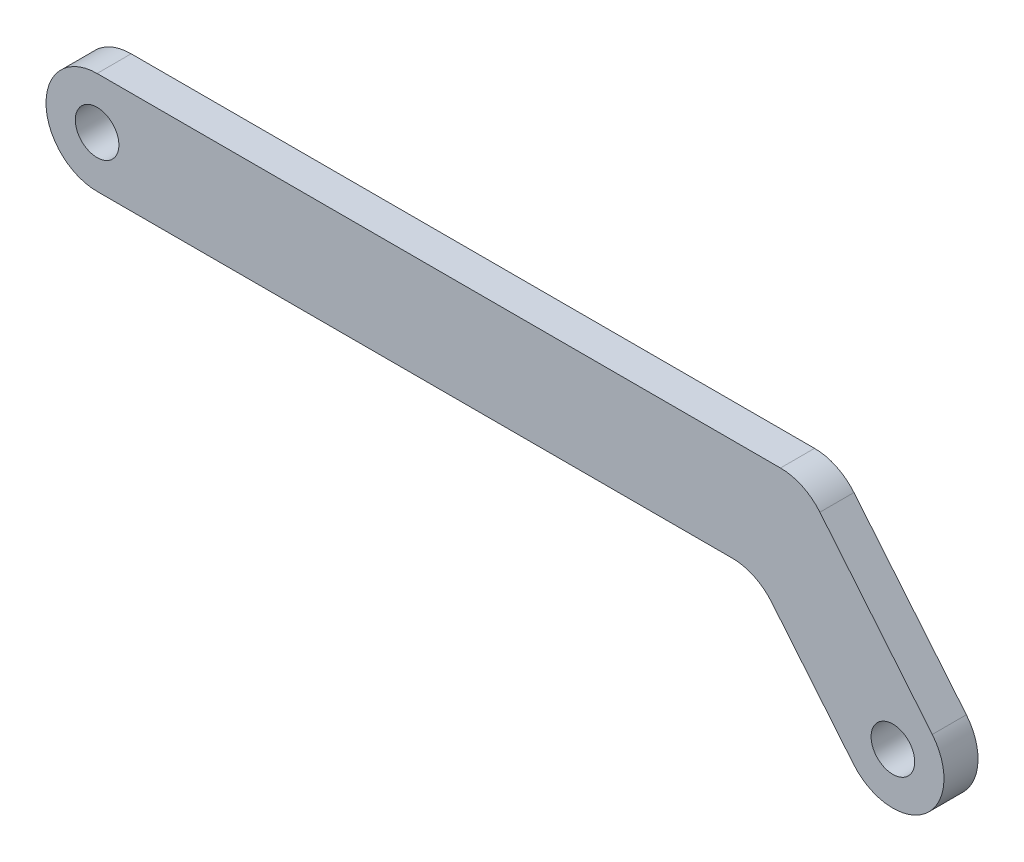
ISO-10303-21;
HEADER;
FILE_DESCRIPTION(('STEP AP214'),'2;1');
FILE_NAME('part.step','',(''),(''),'','','');
FILE_SCHEMA(('AUTOMOTIVE_DESIGN { 1 0 10303 214 1 1 1 1 }'));
ENDSEC;
DATA;
#1=APPLICATION_CONTEXT('core data for automotive mechanical design processes');
#2=APPLICATION_PROTOCOL_DEFINITION('international standard','automotive_design',2000,#1);
#3=PRODUCT_CONTEXT('',#1,'mechanical');
#4=PRODUCT('Part','Part','',(#3));
#5=PRODUCT_RELATED_PRODUCT_CATEGORY('part','',(#4));
#6=PRODUCT_DEFINITION_FORMATION('','',#4);
#7=PRODUCT_DEFINITION_CONTEXT('part definition',#1,'design');
#8=PRODUCT_DEFINITION('design','',#6,#7);
#9=PRODUCT_DEFINITION_SHAPE('','',#8);
#10=(LENGTH_UNIT() NAMED_UNIT(*) SI_UNIT(.MILLI.,.METRE.));
#11=(NAMED_UNIT(*) PLANE_ANGLE_UNIT() SI_UNIT($,.RADIAN.));
#12=(NAMED_UNIT(*) SI_UNIT($,.STERADIAN.) SOLID_ANGLE_UNIT());
#13=UNCERTAINTY_MEASURE_WITH_UNIT(LENGTH_MEASURE(1.E-05),#10,'distance_accuracy_value','');
#14=(GEOMETRIC_REPRESENTATION_CONTEXT(3) GLOBAL_UNCERTAINTY_ASSIGNED_CONTEXT((#13)) GLOBAL_UNIT_ASSIGNED_CONTEXT((#10,
#11,#12)) REPRESENTATION_CONTEXT('',''));
#15=CARTESIAN_POINT('',(0.,0.,0.));
#16=DIRECTION('',(0.,0.,1.));
#17=DIRECTION('',(1.,0.,0.));
#18=AXIS2_PLACEMENT_3D('',#15,#16,#17);
#19=CARTESIAN_POINT('',(0.,0.,3.175));
#20=DIRECTION('',(0.,0.,1.));
#21=DIRECTION('',(1.,0.,0.));
#22=AXIS2_PLACEMENT_3D('',#19,#20,#21);
#23=PLANE('',#22);
#24=CARTESIAN_POINT('',(0.,0.,3.175));
#25=DIRECTION('',(0.,0.,1.));
#26=DIRECTION('',(1.,0.,0.));
#27=AXIS2_PLACEMENT_3D('',#24,#25,#26);
#28=CIRCLE('',#27,2.032);
#29=CARTESIAN_POINT('',(2.032,0.,3.175));
#30=VERTEX_POINT('',#29);
#31=EDGE_CURVE('E152',#30,#30,#28,.T.);
#32=ORIENTED_EDGE('',*,*,#31,.F.);
#33=EDGE_LOOP('',(#32));
#34=FACE_BOUND('',#33,.T.);
#35=CARTESIAN_POINT('',(0.,0.,3.175));
#36=DIRECTION('',(0.,0.,1.));
#37=DIRECTION('',(1.,0.,0.));
#38=AXIS2_PLACEMENT_3D('',#35,#36,#37);
#39=CIRCLE('',#38,4.7625);
#40=CARTESIAN_POINT('',(-3.67366523904712,-3.03077382221387,3.175));
#41=VERTEX_POINT('',#40);
#42=CARTESIAN_POINT('',(3.67366523904712,3.03077382221387,3.175));
#43=VERTEX_POINT('',#42);
#44=EDGE_CURVE('E170',#41,#43,#39,.T.);
#45=ORIENTED_EDGE('',*,*,#44,.T.);
#46=DIRECTION('',(-0.636382954795563,0.771373278540078,0.));
#47=VECTOR('',#46,1.);
#48=CARTESIAN_POINT('',(-6.80383476095287,15.7307738222139,3.175));
#49=LINE('',#48,#47);
#50=CARTESIAN_POINT('',(-6.80383476095287,15.7307738222139,3.175));
#51=VERTEX_POINT('',#50);
#52=EDGE_CURVE('E106',#43,#51,#49,.T.);
#53=ORIENTED_EDGE('',*,*,#52,.T.);
#54=CARTESIAN_POINT('',(-10.4775,12.7,3.175));
#55=DIRECTION('',(0.,0.,1.));
#56=DIRECTION('',(1.,0.,0.));
#57=AXIS2_PLACEMENT_3D('',#54,#55,#56);
#58=CIRCLE('',#57,4.76250000000001);
#59=CARTESIAN_POINT('',(-10.4775,17.4625,3.175));
#60=VERTEX_POINT('',#59);
#61=EDGE_CURVE('E191',#51,#60,#58,.T.);
#62=ORIENTED_EDGE('',*,*,#61,.T.);
#63=DIRECTION('',(-1.,0.,0.));
#64=VECTOR('',#63,1.);
#65=CARTESIAN_POINT('',(-74.1772001431822,17.4625,3.175));
#66=LINE('',#65,#64);
#67=CARTESIAN_POINT('',(-74.1772001431822,17.4625,3.175));
#68=VERTEX_POINT('',#67);
#69=EDGE_CURVE('E205',#60,#68,#66,.T.);
#70=ORIENTED_EDGE('',*,*,#69,.T.);
#71=CARTESIAN_POINT('',(-74.1772001431822,12.7,3.175));
#72=DIRECTION('',(0.,0.,1.));
#73=DIRECTION('',(1.,0.,0.));
#74=AXIS2_PLACEMENT_3D('',#71,#72,#73);
#75=CIRCLE('',#74,4.7625);
#76=CARTESIAN_POINT('',(-74.1772001431822,7.9375,3.175));
#77=VERTEX_POINT('',#76);
#78=EDGE_CURVE('E125',#68,#77,#75,.T.);
#79=ORIENTED_EDGE('',*,*,#78,.T.);
#80=DIRECTION('',(1.,0.,0.));
#81=VECTOR('',#80,1.);
#82=CARTESIAN_POINT('',(-14.9674822847471,7.93750000000001,3.175));
#83=LINE('',#82,#81);
#84=CARTESIAN_POINT('',(-14.9674822847471,7.93750000000001,3.175));
#85=VERTEX_POINT('',#84);
#86=EDGE_CURVE('E119',#77,#85,#83,.T.);
#87=ORIENTED_EDGE('',*,*,#86,.T.);
#88=CARTESIAN_POINT('',(-14.9674822847471,3.17499999999999,3.175));
#89=DIRECTION('',(0.,0.,-1.));
#90=DIRECTION('',(1.,0.,0.));
#91=AXIS2_PLACEMENT_3D('',#88,#89,#90);
#92=CIRCLE('',#91,4.76250000000001);
#93=CARTESIAN_POINT('',(-11.2938170457,6.20577382221387,3.175));
#94=VERTEX_POINT('',#93);
#95=EDGE_CURVE('E123',#85,#94,#92,.T.);
#96=ORIENTED_EDGE('',*,*,#95,.T.);
#97=DIRECTION('',(0.636382954795563,-0.771373278540078,0.));
#98=VECTOR('',#97,1.);
#99=CARTESIAN_POINT('',(-11.2938170457,6.20577382221387,3.175));
#100=LINE('',#99,#98);
#101=EDGE_CURVE('E63',#94,#41,#100,.T.);
#102=ORIENTED_EDGE('',*,*,#101,.T.);
#103=EDGE_LOOP('',(#45,#53,#62,#70,#79,#87,#96,#102));
#104=FACE_BOUND('',#103,.T.);
#105=CARTESIAN_POINT('',(-74.1772001431822,12.7,3.175));
#106=DIRECTION('',(0.,0.,1.));
#107=DIRECTION('',(1.,0.,0.));
#108=AXIS2_PLACEMENT_3D('',#105,#106,#107);
#109=CIRCLE('',#108,2.03200000000001);
#110=CARTESIAN_POINT('',(-72.1452001431822,12.7,3.175));
#111=VERTEX_POINT('',#110);
#112=EDGE_CURVE('E219',#111,#111,#109,.T.);
#113=ORIENTED_EDGE('',*,*,#112,.F.);
#114=EDGE_LOOP('',(#113));
#115=FACE_BOUND('',#114,.T.);
#116=ADVANCED_FACE('F45',(#34,#104,#115),#23,.T.);
#117=CARTESIAN_POINT('',(0.,0.,0.));
#118=DIRECTION('',(0.,0.,1.));
#119=DIRECTION('',(1.,0.,0.));
#120=AXIS2_PLACEMENT_3D('',#117,#118,#119);
#121=PLANE('',#120);
#122=CARTESIAN_POINT('',(0.,0.,0.));
#123=DIRECTION('',(0.,0.,1.));
#124=DIRECTION('',(1.,0.,0.));
#125=AXIS2_PLACEMENT_3D('',#122,#123,#124);
#126=CIRCLE('',#125,4.7625);
#127=CARTESIAN_POINT('',(-3.67366523904712,-3.03077382221387,0.));
#128=VERTEX_POINT('',#127);
#129=CARTESIAN_POINT('',(3.67366523904712,3.03077382221387,0.));
#130=VERTEX_POINT('',#129);
#131=EDGE_CURVE('E147',#128,#130,#126,.T.);
#132=ORIENTED_EDGE('',*,*,#131,.F.);
#133=DIRECTION('',(0.636382954795563,-0.771373278540078,0.));
#134=VECTOR('',#133,1.);
#135=CARTESIAN_POINT('',(-11.2938170457,6.20577382221387,0.));
#136=LINE('',#135,#134);
#137=CARTESIAN_POINT('',(-11.2938170457,6.20577382221387,0.));
#138=VERTEX_POINT('',#137);
#139=EDGE_CURVE('E98',#138,#128,#136,.T.);
#140=ORIENTED_EDGE('',*,*,#139,.F.);
#141=CARTESIAN_POINT('',(-14.9674822847471,3.17499999999999,0.));
#142=DIRECTION('',(0.,0.,-1.));
#143=DIRECTION('',(1.,0.,0.));
#144=AXIS2_PLACEMENT_3D('',#141,#142,#143);
#145=CIRCLE('',#144,4.76250000000001);
#146=CARTESIAN_POINT('',(-14.9674822847471,7.93750000000001,0.));
#147=VERTEX_POINT('',#146);
#148=EDGE_CURVE('E92',#147,#138,#145,.T.);
#149=ORIENTED_EDGE('',*,*,#148,.F.);
#150=DIRECTION('',(1.,0.,0.));
#151=VECTOR('',#150,1.);
#152=CARTESIAN_POINT('',(-14.9674822847471,7.93750000000001,0.));
#153=LINE('',#152,#151);
#154=CARTESIAN_POINT('',(-74.1772001431822,7.9375,0.));
#155=VERTEX_POINT('',#154);
#156=EDGE_CURVE('E134',#155,#147,#153,.T.);
#157=ORIENTED_EDGE('',*,*,#156,.F.);
#158=CARTESIAN_POINT('',(-74.1772001431822,12.7,0.));
#159=DIRECTION('',(0.,0.,1.));
#160=DIRECTION('',(1.,0.,0.));
#161=AXIS2_PLACEMENT_3D('',#158,#159,#160);
#162=CIRCLE('',#161,4.7625);
#163=CARTESIAN_POINT('',(-74.1772001431822,17.4625,0.));
#164=VERTEX_POINT('',#163);
#165=EDGE_CURVE('E161',#164,#155,#162,.T.);
#166=ORIENTED_EDGE('',*,*,#165,.F.);
#167=DIRECTION('',(-1.,0.,0.));
#168=VECTOR('',#167,1.);
#169=CARTESIAN_POINT('',(-74.1772001431822,17.4625,0.));
#170=LINE('',#169,#168);
#171=CARTESIAN_POINT('',(-10.4775,17.4625,0.));
#172=VERTEX_POINT('',#171);
#173=EDGE_CURVE('E158',#172,#164,#170,.T.);
#174=ORIENTED_EDGE('',*,*,#173,.F.);
#175=CARTESIAN_POINT('',(-10.4775,12.7,0.));
#176=DIRECTION('',(0.,0.,1.));
#177=DIRECTION('',(1.,0.,0.));
#178=AXIS2_PLACEMENT_3D('',#175,#176,#177);
#179=CIRCLE('',#178,4.76250000000001);
#180=CARTESIAN_POINT('',(-6.80383476095287,15.7307738222139,0.));
#181=VERTEX_POINT('',#180);
#182=EDGE_CURVE('E155',#181,#172,#179,.T.);
#183=ORIENTED_EDGE('',*,*,#182,.F.);
#184=DIRECTION('',(-0.636382954795563,0.771373278540078,0.));
#185=VECTOR('',#184,1.);
#186=CARTESIAN_POINT('',(-6.80383476095287,15.7307738222139,0.));
#187=LINE('',#186,#185);
#188=EDGE_CURVE('E151',#130,#181,#187,.T.);
#189=ORIENTED_EDGE('',*,*,#188,.F.);
#190=EDGE_LOOP('',(#132,#140,#149,#157,#166,#174,#183,#189));
#191=FACE_BOUND('',#190,.T.);
#192=CARTESIAN_POINT('',(0.,0.,0.));
#193=DIRECTION('',(0.,0.,1.));
#194=DIRECTION('',(1.,0.,0.));
#195=AXIS2_PLACEMENT_3D('',#192,#193,#194);
#196=CIRCLE('',#195,2.032);
#197=CARTESIAN_POINT('',(2.032,0.,0.));
#198=VERTEX_POINT('',#197);
#199=EDGE_CURVE('E215',#198,#198,#196,.T.);
#200=ORIENTED_EDGE('',*,*,#199,.T.);
#201=EDGE_LOOP('',(#200));
#202=FACE_BOUND('',#201,.T.);
#203=CARTESIAN_POINT('',(-74.1772001431822,12.7,0.));
#204=DIRECTION('',(0.,0.,1.));
#205=DIRECTION('',(1.,0.,0.));
#206=AXIS2_PLACEMENT_3D('',#203,#204,#205);
#207=CIRCLE('',#206,2.03200000000001);
#208=CARTESIAN_POINT('',(-72.1452001431822,12.7,0.));
#209=VERTEX_POINT('',#208);
#210=EDGE_CURVE('E223',#209,#209,#207,.T.);
#211=ORIENTED_EDGE('',*,*,#210,.T.);
#212=EDGE_LOOP('',(#211));
#213=FACE_BOUND('',#212,.T.);
#214=ADVANCED_FACE('F195',(#191,#202,#213),#121,.F.);
#215=CARTESIAN_POINT('',(0.,0.,3.175));
#216=DIRECTION('',(0.,0.,-1.));
#217=DIRECTION('',(-1.,0.,0.));
#218=AXIS2_PLACEMENT_3D('',#215,#216,#217);
#219=CYLINDRICAL_SURFACE('',#218,4.7625);
#220=ORIENTED_EDGE('',*,*,#131,.T.);
#221=DIRECTION('',(0.,0.,-1.));
#222=VECTOR('',#221,1.);
#223=CARTESIAN_POINT('',(3.67366523904712,3.03077382221387,3.175));
#224=LINE('',#223,#222);
#225=EDGE_CURVE('E11',#43,#130,#224,.T.);
#226=ORIENTED_EDGE('',*,*,#225,.F.);
#227=ORIENTED_EDGE('',*,*,#44,.F.);
#228=DIRECTION('',(0.,0.,-1.));
#229=VECTOR('',#228,1.);
#230=CARTESIAN_POINT('',(-3.67366523904712,-3.03077382221387,3.175));
#231=LINE('',#230,#229);
#232=EDGE_CURVE('E143',#41,#128,#231,.T.);
#233=ORIENTED_EDGE('',*,*,#232,.T.);
#234=EDGE_LOOP('',(#220,#226,#227,#233));
#235=FACE_BOUND('',#234,.T.);
#236=ADVANCED_FACE('F47',(#235),#219,.T.);
#237=CARTESIAN_POINT('',(-6.80383476095287,15.7307738222139,3.175));
#238=DIRECTION('',(-0.771373278540078,-0.636382954795563,0.));
#239=DIRECTION('',(0.636382954795563,-0.771373278540078,0.));
#240=AXIS2_PLACEMENT_3D('',#237,#238,#239);
#241=PLANE('',#240);
#242=ORIENTED_EDGE('',*,*,#188,.T.);
#243=DIRECTION('',(0.,0.,-1.));
#244=VECTOR('',#243,1.);
#245=CARTESIAN_POINT('',(-6.80383476095287,15.7307738222139,3.175));
#246=LINE('',#245,#244);
#247=EDGE_CURVE('E55',#51,#181,#246,.T.);
#248=ORIENTED_EDGE('',*,*,#247,.F.);
#249=ORIENTED_EDGE('',*,*,#52,.F.);
#250=ORIENTED_EDGE('',*,*,#225,.T.);
#251=EDGE_LOOP('',(#242,#248,#249,#250));
#252=FACE_BOUND('',#251,.T.);
#253=ADVANCED_FACE('F257',(#252),#241,.F.);
#254=CARTESIAN_POINT('',(-10.4775,12.7,3.175));
#255=DIRECTION('',(0.,0.,-1.));
#256=DIRECTION('',(-1.,0.,0.));
#257=AXIS2_PLACEMENT_3D('',#254,#255,#256);
#258=CYLINDRICAL_SURFACE('',#257,4.76250000000001);
#259=ORIENTED_EDGE('',*,*,#182,.T.);
#260=DIRECTION('',(0.,0.,-1.));
#261=VECTOR('',#260,1.);
#262=CARTESIAN_POINT('',(-10.4775,17.4625,3.175));
#263=LINE('',#262,#261);
#264=EDGE_CURVE('E181',#60,#172,#263,.T.);
#265=ORIENTED_EDGE('',*,*,#264,.F.);
#266=ORIENTED_EDGE('',*,*,#61,.F.);
#267=ORIENTED_EDGE('',*,*,#247,.T.);
#268=EDGE_LOOP('',(#259,#265,#266,#267));
#269=FACE_BOUND('',#268,.T.);
#270=ADVANCED_FACE('F189',(#269),#258,.T.);
#271=CARTESIAN_POINT('',(-74.1772001431822,17.4625,3.175));
#272=DIRECTION('',(0.,-1.,0.));
#273=DIRECTION('',(1.,0.,0.));
#274=AXIS2_PLACEMENT_3D('',#271,#272,#273);
#275=PLANE('',#274);
#276=ORIENTED_EDGE('',*,*,#173,.T.);
#277=DIRECTION('',(0.,0.,-1.));
#278=VECTOR('',#277,1.);
#279=CARTESIAN_POINT('',(-74.1772001431822,17.4625,3.175));
#280=LINE('',#279,#278);
#281=EDGE_CURVE('E177',#68,#164,#280,.T.);
#282=ORIENTED_EDGE('',*,*,#281,.F.);
#283=ORIENTED_EDGE('',*,*,#69,.F.);
#284=ORIENTED_EDGE('',*,*,#264,.T.);
#285=EDGE_LOOP('',(#276,#282,#283,#284));
#286=FACE_BOUND('',#285,.T.);
#287=ADVANCED_FACE('F200',(#286),#275,.F.);
#288=CARTESIAN_POINT('',(-74.1772001431822,12.7,3.175));
#289=DIRECTION('',(0.,0.,-1.));
#290=DIRECTION('',(-1.,0.,0.));
#291=AXIS2_PLACEMENT_3D('',#288,#289,#290);
#292=CYLINDRICAL_SURFACE('',#291,4.7625);
#293=ORIENTED_EDGE('',*,*,#165,.T.);
#294=DIRECTION('',(0.,0.,-1.));
#295=VECTOR('',#294,1.);
#296=CARTESIAN_POINT('',(-74.1772001431822,7.9375,3.175));
#297=LINE('',#296,#295);
#298=EDGE_CURVE('E136',#77,#155,#297,.T.);
#299=ORIENTED_EDGE('',*,*,#298,.F.);
#300=ORIENTED_EDGE('',*,*,#78,.F.);
#301=ORIENTED_EDGE('',*,*,#281,.T.);
#302=EDGE_LOOP('',(#293,#299,#300,#301));
#303=FACE_BOUND('',#302,.T.);
#304=ADVANCED_FACE('F203',(#303),#292,.T.);
#305=CARTESIAN_POINT('',(-14.9674822847471,7.93750000000001,3.175));
#306=DIRECTION('',(0.,1.,0.));
#307=DIRECTION('',(-1.,0.,0.));
#308=AXIS2_PLACEMENT_3D('',#305,#306,#307);
#309=PLANE('',#308);
#310=ORIENTED_EDGE('',*,*,#156,.T.);
#311=DIRECTION('',(0.,0.,-1.));
#312=VECTOR('',#311,1.);
#313=CARTESIAN_POINT('',(-14.9674822847471,7.93750000000001,3.175));
#314=LINE('',#313,#312);
#315=EDGE_CURVE('E131',#85,#147,#314,.T.);
#316=ORIENTED_EDGE('',*,*,#315,.F.);
#317=ORIENTED_EDGE('',*,*,#86,.F.);
#318=ORIENTED_EDGE('',*,*,#298,.T.);
#319=EDGE_LOOP('',(#310,#316,#317,#318));
#320=FACE_BOUND('',#319,.T.);
#321=ADVANCED_FACE('F132',(#320),#309,.F.);
#322=CARTESIAN_POINT('',(-14.9674822847471,3.17499999999999,3.175));
#323=DIRECTION('',(0.,0.,-1.));
#324=DIRECTION('',(-1.,0.,0.));
#325=AXIS2_PLACEMENT_3D('',#322,#323,#324);
#326=CYLINDRICAL_SURFACE('',#325,4.76250000000001);
#327=ORIENTED_EDGE('',*,*,#148,.T.);
#328=DIRECTION('',(0.,0.,-1.));
#329=VECTOR('',#328,1.);
#330=CARTESIAN_POINT('',(-11.2938170457,6.20577382221387,3.175));
#331=LINE('',#330,#329);
#332=EDGE_CURVE('E137',#94,#138,#331,.T.);
#333=ORIENTED_EDGE('',*,*,#332,.F.);
#334=ORIENTED_EDGE('',*,*,#95,.F.);
#335=ORIENTED_EDGE('',*,*,#315,.T.);
#336=EDGE_LOOP('',(#327,#333,#334,#335));
#337=FACE_BOUND('',#336,.T.);
#338=ADVANCED_FACE('F139',(#337),#326,.F.);
#339=CARTESIAN_POINT('',(-11.2938170457,6.20577382221387,3.175));
#340=DIRECTION('',(0.771373278540078,0.636382954795563,0.));
#341=DIRECTION('',(-0.636382954795563,0.771373278540078,0.));
#342=AXIS2_PLACEMENT_3D('',#339,#340,#341);
#343=PLANE('',#342);
#344=ORIENTED_EDGE('',*,*,#139,.T.);
#345=ORIENTED_EDGE('',*,*,#232,.F.);
#346=ORIENTED_EDGE('',*,*,#101,.F.);
#347=ORIENTED_EDGE('',*,*,#332,.T.);
#348=EDGE_LOOP('',(#344,#345,#346,#347));
#349=FACE_BOUND('',#348,.T.);
#350=ADVANCED_FACE('F245',(#349),#343,.F.);
#351=CARTESIAN_POINT('',(0.,0.,3.175));
#352=DIRECTION('',(0.,0.,-1.));
#353=DIRECTION('',(-1.,0.,0.));
#354=AXIS2_PLACEMENT_3D('',#351,#352,#353);
#355=CYLINDRICAL_SURFACE('',#354,2.032);
#356=ORIENTED_EDGE('',*,*,#31,.T.);
#357=EDGE_LOOP('',(#356));
#358=FACE_BOUND('',#357,.T.);
#359=ORIENTED_EDGE('',*,*,#199,.F.);
#360=EDGE_LOOP('',(#359));
#361=FACE_BOUND('',#360,.T.);
#362=ADVANCED_FACE('F242',(#358,#361),#355,.F.);
#363=CARTESIAN_POINT('',(-74.1772001431822,12.7,3.175));
#364=DIRECTION('',(0.,0.,-1.));
#365=DIRECTION('',(-1.,0.,0.));
#366=AXIS2_PLACEMENT_3D('',#363,#364,#365);
#367=CYLINDRICAL_SURFACE('',#366,2.03200000000001);
#368=ORIENTED_EDGE('',*,*,#112,.T.);
#369=EDGE_LOOP('',(#368));
#370=FACE_BOUND('',#369,.T.);
#371=ORIENTED_EDGE('',*,*,#210,.F.);
#372=EDGE_LOOP('',(#371));
#373=FACE_BOUND('',#372,.T.);
#374=ADVANCED_FACE('F231',(#370,#373),#367,.F.);
#375=CLOSED_SHELL('',(#116,#214,#236,#253,#270,#287,#304,#321,#338,#350,#362,#374));
#376=MANIFOLD_SOLID_BREP('B2',#375);
#377=ADVANCED_BREP_SHAPE_REPRESENTATION('',(#18,#376),#14);
#378=SHAPE_DEFINITION_REPRESENTATION(#9,#377);
ENDSEC;
END-ISO-10303-21;
